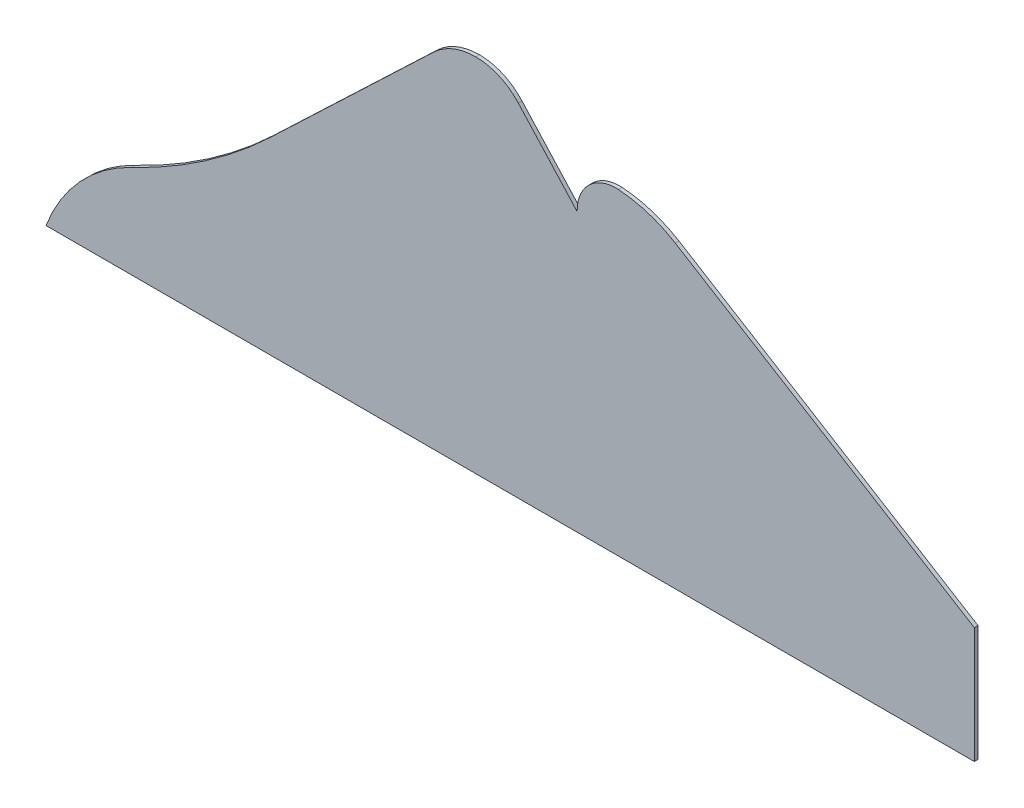
ISO-10303-21;
HEADER;
FILE_DESCRIPTION(('STEP AP214'),'2;1');
FILE_NAME('part.step','',(''),(''),'','','');
FILE_SCHEMA(('AUTOMOTIVE_DESIGN { 1 0 10303 214 1 1 1 1 }'));
ENDSEC;
DATA;
#1=APPLICATION_CONTEXT('core data for automotive mechanical design processes');
#2=APPLICATION_PROTOCOL_DEFINITION('international standard','automotive_design',2000,#1);
#3=PRODUCT_CONTEXT('',#1,'mechanical');
#4=PRODUCT('Part','Part','',(#3));
#5=PRODUCT_RELATED_PRODUCT_CATEGORY('part','',(#4));
#6=PRODUCT_DEFINITION_FORMATION('','',#4);
#7=PRODUCT_DEFINITION_CONTEXT('part definition',#1,'design');
#8=PRODUCT_DEFINITION('design','',#6,#7);
#9=PRODUCT_DEFINITION_SHAPE('','',#8);
#10=(LENGTH_UNIT() NAMED_UNIT(*) SI_UNIT(.MILLI.,.METRE.));
#11=(NAMED_UNIT(*) PLANE_ANGLE_UNIT() SI_UNIT($,.RADIAN.));
#12=(NAMED_UNIT(*) SI_UNIT($,.STERADIAN.) SOLID_ANGLE_UNIT());
#13=UNCERTAINTY_MEASURE_WITH_UNIT(LENGTH_MEASURE(1.E-05),#10,'distance_accuracy_value','');
#14=(GEOMETRIC_REPRESENTATION_CONTEXT(3) GLOBAL_UNCERTAINTY_ASSIGNED_CONTEXT((#13)) GLOBAL_UNIT_ASSIGNED_CONTEXT((#10,
#11,#12)) REPRESENTATION_CONTEXT('',''));
#15=CARTESIAN_POINT('',(0.,0.,0.));
#16=DIRECTION('',(0.,0.,1.));
#17=DIRECTION('',(1.,0.,0.));
#18=AXIS2_PLACEMENT_3D('',#15,#16,#17);
#19=CARTESIAN_POINT('',(0.,0.,1.5875));
#20=DIRECTION('',(0.,0.,-1.));
#21=DIRECTION('',(-1.,0.,0.));
#22=AXIS2_PLACEMENT_3D('',#19,#20,#21);
#23=PLANE('',#22);
#24=CARTESIAN_POINT('',(-124.628574844683,496.763661704891,1.5875));
#25=DIRECTION('',(0.,0.,1.));
#26=DIRECTION('',(1.,0.,0.));
#27=AXIS2_PLACEMENT_3D('',#24,#25,#26);
#28=CIRCLE('',#27,461.330018226045);
#29=CARTESIAN_POINT('',(73.7997357873179,80.2884628560599,1.5875));
#30=VERTEX_POINT('',#29);
#31=CARTESIAN_POINT('',(193.450443102097,162.621290763319,1.5875));
#32=VERTEX_POINT('',#31);
#33=EDGE_CURVE('E184',#30,#32,#28,.T.);
#34=ORIENTED_EDGE('',*,*,#33,.F.);
#35=CARTESIAN_POINT('',(136.580714581107,-51.480640775319,1.5875));
#36=DIRECTION('',(0.,0.,1.));
#37=DIRECTION('',(1.,0.,0.));
#38=AXIS2_PLACEMENT_3D('',#35,#36,#37);
#39=CIRCLE('',#38,145.960775450541);
#40=CARTESIAN_POINT('',(0.,0.,1.5875));
#41=VERTEX_POINT('',#40);
#42=EDGE_CURVE('E187',#41,#30,#39,.F.);
#43=ORIENTED_EDGE('',*,*,#42,.F.);
#44=DIRECTION('',(1.,0.,0.));
#45=VECTOR('',#44,1.);
#46=CARTESIAN_POINT('',(0.,0.,1.5875));
#47=LINE('',#46,#45);
#48=CARTESIAN_POINT('',(800.1,0.,1.5875));
#49=VERTEX_POINT('',#48);
#50=EDGE_CURVE('E97',#41,#49,#47,.T.);
#51=ORIENTED_EDGE('',*,*,#50,.T.);
#52=DIRECTION('',(0.,1.,0.));
#53=VECTOR('',#52,1.);
#54=CARTESIAN_POINT('',(800.1,0.,1.5875));
#55=LINE('',#54,#53);
#56=CARTESIAN_POINT('',(800.1,99.9416156075471,1.5875));
#57=VERTEX_POINT('',#56);
#58=EDGE_CURVE('E240',#49,#57,#55,.T.);
#59=ORIENTED_EDGE('',*,*,#58,.T.);
#60=DIRECTION('',(0.852326383875774,-0.523010263139497,0.));
#61=VECTOR('',#60,1.);
#62=CARTESIAN_POINT('',(263.410660555489,429.268547117798,1.5875));
#63=LINE('',#62,#61);
#64=CARTESIAN_POINT('',(542.448186048016,258.043659100121,1.5875));
#65=VERTEX_POINT('',#64);
#66=EDGE_CURVE('E220',#65,#57,#63,.T.);
#67=ORIENTED_EDGE('',*,*,#66,.F.);
#68=CARTESIAN_POINT('',(486.604567153053,167.037816366619,1.5875));
#69=DIRECTION('',(0.,0.,1.));
#70=DIRECTION('',(1.,0.,0.));
#71=AXIS2_PLACEMENT_3D('',#68,#69,#70);
#72=CIRCLE('',#71,106.773466661529);
#73=CARTESIAN_POINT('',(493.302964879679,273.600965019503,1.5875));
#74=VERTEX_POINT('',#73);
#75=EDGE_CURVE('E217',#74,#65,#72,.F.);
#76=ORIENTED_EDGE('',*,*,#75,.F.);
#77=CARTESIAN_POINT('',(491.207312986588,240.261758641765,1.5875));
#78=DIRECTION('',(0.,0.,1.));
#79=DIRECTION('',(1.,0.,0.));
#80=AXIS2_PLACEMENT_3D('',#77,#78,#79);
#81=CIRCLE('',#80,33.4050061930011);
#82=CARTESIAN_POINT('',(457.816588667786,239.285045674626,1.5875));
#83=VERTEX_POINT('',#82);
#84=EDGE_CURVE('E199',#83,#74,#81,.F.);
#85=ORIENTED_EDGE('',*,*,#84,.F.);
#86=DIRECTION('',(0.673362846685717,-0.739312164584966,0.));
#87=VECTOR('',#86,1.);
#88=CARTESIAN_POINT('',(369.356685023349,336.408733392535,1.5875));
#89=LINE('',#88,#87);
#90=CARTESIAN_POINT('',(407.105710958129,294.962558849076,1.5875));
#91=VERTEX_POINT('',#90);
#92=EDGE_CURVE('E205',#91,#83,#89,.T.);
#93=ORIENTED_EDGE('',*,*,#92,.F.);
#94=CARTESIAN_POINT('',(370.466975789916,261.592131317044,1.5875));
#95=DIRECTION('',(0.,0.,1.));
#96=DIRECTION('',(1.,0.,0.));
#97=AXIS2_PLACEMENT_3D('',#94,#95,#96);
#98=CIRCLE('',#97,49.5578686829556);
#99=CARTESIAN_POINT('',(370.466975789916,311.15,1.5875));
#100=VERTEX_POINT('',#99);
#101=EDGE_CURVE('E222',#100,#91,#98,.F.);
#102=ORIENTED_EDGE('',*,*,#101,.F.);
#103=CARTESIAN_POINT('',(370.466975789916,258.664479880907,1.5875));
#104=DIRECTION('',(0.,0.,1.));
#105=DIRECTION('',(1.,0.,0.));
#106=AXIS2_PLACEMENT_3D('',#103,#104,#105);
#107=CIRCLE('',#106,52.4855201190928);
#108=CARTESIAN_POINT('',(334.279123197746,296.679860280676,1.5875));
#109=VERTEX_POINT('',#108);
#110=EDGE_CURVE('E193',#109,#100,#107,.F.);
#111=ORIENTED_EDGE('',*,*,#110,.F.);
#112=DIRECTION('',(0.724302251621198,0.68948259462909,0.));
#113=VECTOR('',#112,1.);
#114=CARTESIAN_POINT('',(10.7516167145968,-11.294585614797,1.5875));
#115=LINE('',#114,#113);
#116=EDGE_CURVE('E165',#32,#109,#115,.T.);
#117=ORIENTED_EDGE('',*,*,#116,.F.);
#118=EDGE_LOOP('',(#34,#43,#51,#59,#67,#76,#85,#93,#102,#111,#117));
#119=FACE_BOUND('',#118,.T.);
#120=ADVANCED_FACE('F73',(#119),#23,.F.);
#121=CARTESIAN_POINT('',(0.,0.,-1.5875));
#122=DIRECTION('',(0.,0.,-1.));
#123=DIRECTION('',(-1.,0.,0.));
#124=AXIS2_PLACEMENT_3D('',#121,#122,#123);
#125=PLANE('',#124);
#126=CARTESIAN_POINT('',(136.580714581107,-51.480640775319,-1.5875));
#127=DIRECTION('',(0.,0.,1.));
#128=DIRECTION('',(1.,0.,0.));
#129=AXIS2_PLACEMENT_3D('',#126,#127,#128);
#130=CIRCLE('',#129,145.960775450541);
#131=CARTESIAN_POINT('',(0.,0.,-1.5875));
#132=VERTEX_POINT('',#131);
#133=CARTESIAN_POINT('',(73.7997357873179,80.2884628560599,-1.5875));
#134=VERTEX_POINT('',#133);
#135=EDGE_CURVE('E179',#132,#134,#130,.F.);
#136=ORIENTED_EDGE('',*,*,#135,.T.);
#137=CARTESIAN_POINT('',(-124.628574844683,496.763661704891,-1.5875));
#138=DIRECTION('',(0.,0.,1.));
#139=DIRECTION('',(1.,0.,0.));
#140=AXIS2_PLACEMENT_3D('',#137,#138,#139);
#141=CIRCLE('',#140,461.330018226045);
#142=CARTESIAN_POINT('',(193.450443102097,162.621290763319,-1.5875));
#143=VERTEX_POINT('',#142);
#144=EDGE_CURVE('E169',#134,#143,#141,.T.);
#145=ORIENTED_EDGE('',*,*,#144,.T.);
#146=DIRECTION('',(0.724302251621198,0.68948259462909,0.));
#147=VECTOR('',#146,1.);
#148=CARTESIAN_POINT('',(10.7516167145968,-11.294585614797,-1.5875));
#149=LINE('',#148,#147);
#150=CARTESIAN_POINT('',(334.279123197746,296.679860280676,-1.5875));
#151=VERTEX_POINT('',#150);
#152=EDGE_CURVE('E162',#143,#151,#149,.T.);
#153=ORIENTED_EDGE('',*,*,#152,.T.);
#154=CARTESIAN_POINT('',(370.466975789916,258.664479880907,-1.5875));
#155=DIRECTION('',(0.,0.,1.));
#156=DIRECTION('',(1.,0.,0.));
#157=AXIS2_PLACEMENT_3D('',#154,#155,#156);
#158=CIRCLE('',#157,52.4855201190928);
#159=CARTESIAN_POINT('',(370.466975789916,311.15,-1.5875));
#160=VERTEX_POINT('',#159);
#161=EDGE_CURVE('E172',#151,#160,#158,.F.);
#162=ORIENTED_EDGE('',*,*,#161,.T.);
#163=CARTESIAN_POINT('',(370.466975789916,261.592131317044,-1.5875));
#164=DIRECTION('',(0.,0.,1.));
#165=DIRECTION('',(1.,0.,0.));
#166=AXIS2_PLACEMENT_3D('',#163,#164,#165);
#167=CIRCLE('',#166,49.5578686829556);
#168=CARTESIAN_POINT('',(407.105710958129,294.962558849076,-1.5875));
#169=VERTEX_POINT('',#168);
#170=EDGE_CURVE('E209',#160,#169,#167,.F.);
#171=ORIENTED_EDGE('',*,*,#170,.T.);
#172=DIRECTION('',(0.673362846685717,-0.739312164584966,0.));
#173=VECTOR('',#172,1.);
#174=CARTESIAN_POINT('',(369.356685023349,336.408733392535,-1.5875));
#175=LINE('',#174,#173);
#176=CARTESIAN_POINT('',(457.816588667786,239.285045674626,-1.5875));
#177=VERTEX_POINT('',#176);
#178=EDGE_CURVE('E211',#169,#177,#175,.T.);
#179=ORIENTED_EDGE('',*,*,#178,.T.);
#180=CARTESIAN_POINT('',(491.207312986588,240.261758641765,-1.5875));
#181=DIRECTION('',(0.,0.,1.));
#182=DIRECTION('',(1.,0.,0.));
#183=AXIS2_PLACEMENT_3D('',#180,#181,#182);
#184=CIRCLE('',#183,33.4050061930011);
#185=CARTESIAN_POINT('',(493.302964879679,273.600965019503,-1.5875));
#186=VERTEX_POINT('',#185);
#187=EDGE_CURVE('E201',#177,#186,#184,.F.);
#188=ORIENTED_EDGE('',*,*,#187,.T.);
#189=CARTESIAN_POINT('',(486.604567153053,167.037816366619,-1.5875));
#190=DIRECTION('',(0.,0.,1.));
#191=DIRECTION('',(1.,0.,0.));
#192=AXIS2_PLACEMENT_3D('',#189,#190,#191);
#193=CIRCLE('',#192,106.773466661529);
#194=CARTESIAN_POINT('',(542.448186048016,258.043659100121,-1.5875));
#195=VERTEX_POINT('',#194);
#196=EDGE_CURVE('E204',#186,#195,#193,.F.);
#197=ORIENTED_EDGE('',*,*,#196,.T.);
#198=DIRECTION('',(0.852326383875774,-0.523010263139497,0.));
#199=VECTOR('',#198,1.);
#200=CARTESIAN_POINT('',(263.410660555489,429.268547117798,-1.5875));
#201=LINE('',#200,#199);
#202=CARTESIAN_POINT('',(800.1,99.9416156075471,-1.5875));
#203=VERTEX_POINT('',#202);
#204=EDGE_CURVE('E88',#195,#203,#201,.T.);
#205=ORIENTED_EDGE('',*,*,#204,.T.);
#206=DIRECTION('',(0.,1.,0.));
#207=VECTOR('',#206,1.);
#208=CARTESIAN_POINT('',(800.1,0.,-1.5875));
#209=LINE('',#208,#207);
#210=CARTESIAN_POINT('',(800.1,0.,-1.5875));
#211=VERTEX_POINT('',#210);
#212=EDGE_CURVE('E241',#211,#203,#209,.T.);
#213=ORIENTED_EDGE('',*,*,#212,.F.);
#214=DIRECTION('',(1.,0.,0.));
#215=VECTOR('',#214,1.);
#216=CARTESIAN_POINT('',(0.,0.,-1.5875));
#217=LINE('',#216,#215);
#218=EDGE_CURVE('E229',#132,#211,#217,.T.);
#219=ORIENTED_EDGE('',*,*,#218,.F.);
#220=EDGE_LOOP('',(#136,#145,#153,#162,#171,#179,#188,#197,#205,#213,#219));
#221=FACE_BOUND('',#220,.T.);
#222=ADVANCED_FACE('F182',(#221),#125,.T.);
#223=CARTESIAN_POINT('',(0.,0.,1.5875));
#224=DIRECTION('',(0.,1.,0.));
#225=DIRECTION('',(0.,0.,1.));
#226=AXIS2_PLACEMENT_3D('',#223,#224,#225);
#227=PLANE('',#226);
#228=ORIENTED_EDGE('',*,*,#218,.T.);
#229=DIRECTION('',(0.,0.,-1.));
#230=VECTOR('',#229,1.);
#231=CARTESIAN_POINT('',(800.1,0.,1.5875));
#232=LINE('',#231,#230);
#233=EDGE_CURVE('E81',#49,#211,#232,.T.);
#234=ORIENTED_EDGE('',*,*,#233,.F.);
#235=ORIENTED_EDGE('',*,*,#50,.F.);
#236=DIRECTION('',(0.,0.,-1.));
#237=VECTOR('',#236,1.);
#238=CARTESIAN_POINT('',(0.,0.,1.5875));
#239=LINE('',#238,#237);
#240=EDGE_CURVE('E12',#41,#132,#239,.T.);
#241=ORIENTED_EDGE('',*,*,#240,.T.);
#242=EDGE_LOOP('',(#228,#234,#235,#241));
#243=FACE_BOUND('',#242,.T.);
#244=ADVANCED_FACE('F75',(#243),#227,.F.);
#245=CARTESIAN_POINT('',(800.1,0.,1.5875));
#246=DIRECTION('',(-1.,0.,0.));
#247=DIRECTION('',(0.,0.,1.));
#248=AXIS2_PLACEMENT_3D('',#245,#246,#247);
#249=PLANE('',#248);
#250=ORIENTED_EDGE('',*,*,#212,.T.);
#251=DIRECTION('',(0.,0.,1.));
#252=VECTOR('',#251,1.);
#253=CARTESIAN_POINT('',(800.1,99.9416156075471,-1.5875));
#254=LINE('',#253,#252);
#255=EDGE_CURVE('E233',#203,#57,#254,.T.);
#256=ORIENTED_EDGE('',*,*,#255,.T.);
#257=ORIENTED_EDGE('',*,*,#58,.F.);
#258=ORIENTED_EDGE('',*,*,#233,.T.);
#259=EDGE_LOOP('',(#250,#256,#257,#258));
#260=FACE_BOUND('',#259,.T.);
#261=ADVANCED_FACE('F249',(#260),#249,.F.);
#262=CARTESIAN_POINT('',(491.207312986588,240.261758641765,-1.5875));
#263=DIRECTION('',(0.,0.,1.));
#264=DIRECTION('',(1.,0.,0.));
#265=AXIS2_PLACEMENT_3D('',#262,#263,#264);
#266=CYLINDRICAL_SURFACE('',#265,33.4050061930011);
#267=ORIENTED_EDGE('',*,*,#84,.T.);
#268=DIRECTION('',(0.,0.,1.));
#269=VECTOR('',#268,1.);
#270=CARTESIAN_POINT('',(493.302964879679,273.600965019503,-1.5875));
#271=LINE('',#270,#269);
#272=EDGE_CURVE('E214',#186,#74,#271,.T.);
#273=ORIENTED_EDGE('',*,*,#272,.F.);
#274=ORIENTED_EDGE('',*,*,#187,.F.);
#275=DIRECTION('',(0.,0.,1.));
#276=VECTOR('',#275,1.);
#277=CARTESIAN_POINT('',(457.816588667786,239.285045674626,-1.5875));
#278=LINE('',#277,#276);
#279=EDGE_CURVE('E227',#177,#83,#278,.T.);
#280=ORIENTED_EDGE('',*,*,#279,.T.);
#281=EDGE_LOOP('',(#267,#273,#274,#280));
#282=FACE_BOUND('',#281,.T.);
#283=ADVANCED_FACE('F267',(#282),#266,.T.);
#284=CARTESIAN_POINT('',(369.356685023349,336.408733392535,-1.5875));
#285=DIRECTION('',(-0.739312164584966,-0.673362846685717,0.));
#286=DIRECTION('',(0.673362846685717,-0.739312164584966,0.));
#287=AXIS2_PLACEMENT_3D('',#284,#285,#286);
#288=PLANE('',#287);
#289=ORIENTED_EDGE('',*,*,#92,.T.);
#290=ORIENTED_EDGE('',*,*,#279,.F.);
#291=ORIENTED_EDGE('',*,*,#178,.F.);
#292=DIRECTION('',(0.,0.,1.));
#293=VECTOR('',#292,1.);
#294=CARTESIAN_POINT('',(407.105710958129,294.962558849076,-1.5875));
#295=LINE('',#294,#293);
#296=EDGE_CURVE('E230',#169,#91,#295,.T.);
#297=ORIENTED_EDGE('',*,*,#296,.T.);
#298=EDGE_LOOP('',(#289,#290,#291,#297));
#299=FACE_BOUND('',#298,.T.);
#300=ADVANCED_FACE('F274',(#299),#288,.F.);
#301=CARTESIAN_POINT('',(370.466975789916,261.592131317044,-1.5875));
#302=DIRECTION('',(0.,0.,1.));
#303=DIRECTION('',(1.,0.,0.));
#304=AXIS2_PLACEMENT_3D('',#301,#302,#303);
#305=CYLINDRICAL_SURFACE('',#304,49.5578686829556);
#306=ORIENTED_EDGE('',*,*,#101,.T.);
#307=ORIENTED_EDGE('',*,*,#296,.F.);
#308=ORIENTED_EDGE('',*,*,#170,.F.);
#309=DIRECTION('',(0.,0.,1.));
#310=VECTOR('',#309,1.);
#311=CARTESIAN_POINT('',(370.466975789916,311.15,-1.5875));
#312=LINE('',#311,#310);
#313=EDGE_CURVE('E175',#160,#100,#312,.T.);
#314=ORIENTED_EDGE('',*,*,#313,.T.);
#315=EDGE_LOOP('',(#306,#307,#308,#314));
#316=FACE_BOUND('',#315,.T.);
#317=ADVANCED_FACE('F285',(#316),#305,.T.);
#318=CARTESIAN_POINT('',(263.410660555489,429.268547117798,-1.5875));
#319=DIRECTION('',(-0.523010263139497,-0.852326383875774,0.));
#320=DIRECTION('',(0.852326383875774,-0.523010263139497,0.));
#321=AXIS2_PLACEMENT_3D('',#318,#319,#320);
#322=PLANE('',#321);
#323=ORIENTED_EDGE('',*,*,#66,.T.);
#324=ORIENTED_EDGE('',*,*,#255,.F.);
#325=ORIENTED_EDGE('',*,*,#204,.F.);
#326=DIRECTION('',(0.,0.,1.));
#327=VECTOR('',#326,1.);
#328=CARTESIAN_POINT('',(542.448186048016,258.043659100121,-1.5875));
#329=LINE('',#328,#327);
#330=EDGE_CURVE('E236',#195,#65,#329,.T.);
#331=ORIENTED_EDGE('',*,*,#330,.T.);
#332=EDGE_LOOP('',(#323,#324,#325,#331));
#333=FACE_BOUND('',#332,.T.);
#334=ADVANCED_FACE('F258',(#333),#322,.F.);
#335=CARTESIAN_POINT('',(486.604567153053,167.037816366619,-1.5875));
#336=DIRECTION('',(0.,0.,1.));
#337=DIRECTION('',(1.,0.,0.));
#338=AXIS2_PLACEMENT_3D('',#335,#336,#337);
#339=CYLINDRICAL_SURFACE('',#338,106.773466661529);
#340=ORIENTED_EDGE('',*,*,#75,.T.);
#341=ORIENTED_EDGE('',*,*,#330,.F.);
#342=ORIENTED_EDGE('',*,*,#196,.F.);
#343=ORIENTED_EDGE('',*,*,#272,.T.);
#344=EDGE_LOOP('',(#340,#341,#342,#343));
#345=FACE_BOUND('',#344,.T.);
#346=ADVANCED_FACE('F255',(#345),#339,.T.);
#347=CARTESIAN_POINT('',(10.7516167145968,-11.294585614797,-1.5875));
#348=DIRECTION('',(0.68948259462909,-0.724302251621198,0.));
#349=DIRECTION('',(0.724302251621198,0.68948259462909,0.));
#350=AXIS2_PLACEMENT_3D('',#347,#348,#349);
#351=PLANE('',#350);
#352=ORIENTED_EDGE('',*,*,#116,.T.);
#353=DIRECTION('',(0.,0.,1.));
#354=VECTOR('',#353,1.);
#355=CARTESIAN_POINT('',(334.279123197746,296.679860280676,-1.5875));
#356=LINE('',#355,#354);
#357=EDGE_CURVE('E158',#151,#109,#356,.T.);
#358=ORIENTED_EDGE('',*,*,#357,.F.);
#359=ORIENTED_EDGE('',*,*,#152,.F.);
#360=DIRECTION('',(0.,0.,1.));
#361=VECTOR('',#360,1.);
#362=CARTESIAN_POINT('',(193.450443102097,162.621290763319,-1.5875));
#363=LINE('',#362,#361);
#364=EDGE_CURVE('E197',#143,#32,#363,.T.);
#365=ORIENTED_EDGE('',*,*,#364,.T.);
#366=EDGE_LOOP('',(#352,#358,#359,#365));
#367=FACE_BOUND('',#366,.T.);
#368=ADVANCED_FACE('F160',(#367),#351,.F.);
#369=CARTESIAN_POINT('',(-124.628574844683,496.763661704891,-1.5875));
#370=DIRECTION('',(0.,0.,1.));
#371=DIRECTION('',(1.,0.,0.));
#372=AXIS2_PLACEMENT_3D('',#369,#370,#371);
#373=CYLINDRICAL_SURFACE('',#372,461.330018226045);
#374=ORIENTED_EDGE('',*,*,#33,.T.);
#375=ORIENTED_EDGE('',*,*,#364,.F.);
#376=ORIENTED_EDGE('',*,*,#144,.F.);
#377=DIRECTION('',(0.,0.,1.));
#378=VECTOR('',#377,1.);
#379=CARTESIAN_POINT('',(73.7997357873179,80.2884628560599,-1.5875));
#380=LINE('',#379,#378);
#381=EDGE_CURVE('E168',#134,#30,#380,.T.);
#382=ORIENTED_EDGE('',*,*,#381,.T.);
#383=EDGE_LOOP('',(#374,#375,#376,#382));
#384=FACE_BOUND('',#383,.T.);
#385=ADVANCED_FACE('F281',(#384),#373,.F.);
#386=CARTESIAN_POINT('',(136.580714581107,-51.480640775319,-1.5875));
#387=DIRECTION('',(0.,0.,1.));
#388=DIRECTION('',(1.,0.,0.));
#389=AXIS2_PLACEMENT_3D('',#386,#387,#388);
#390=CYLINDRICAL_SURFACE('',#389,145.960775450541);
#391=ORIENTED_EDGE('',*,*,#42,.T.);
#392=ORIENTED_EDGE('',*,*,#381,.F.);
#393=ORIENTED_EDGE('',*,*,#135,.F.);
#394=ORIENTED_EDGE('',*,*,#240,.F.);
#395=EDGE_LOOP('',(#391,#392,#393,#394));
#396=FACE_BOUND('',#395,.T.);
#397=ADVANCED_FACE('F279',(#396),#390,.T.);
#398=CARTESIAN_POINT('',(370.466975789916,258.664479880907,-1.5875));
#399=DIRECTION('',(0.,0.,1.));
#400=DIRECTION('',(1.,0.,0.));
#401=AXIS2_PLACEMENT_3D('',#398,#399,#400);
#402=CYLINDRICAL_SURFACE('',#401,52.4855201190928);
#403=ORIENTED_EDGE('',*,*,#110,.T.);
#404=ORIENTED_EDGE('',*,*,#313,.F.);
#405=ORIENTED_EDGE('',*,*,#161,.F.);
#406=ORIENTED_EDGE('',*,*,#357,.T.);
#407=EDGE_LOOP('',(#403,#404,#405,#406));
#408=FACE_BOUND('',#407,.T.);
#409=ADVANCED_FACE('F173',(#408),#402,.T.);
#410=CLOSED_SHELL('',(#120,#222,#244,#261,#283,#300,#317,#334,#346,#368,#385,#397,#409));
#411=MANIFOLD_SOLID_BREP('B2',#410);
#412=ADVANCED_BREP_SHAPE_REPRESENTATION('',(#18,#411),#14);
#413=SHAPE_DEFINITION_REPRESENTATION(#9,#412);
ENDSEC;
END-ISO-10303-21;
